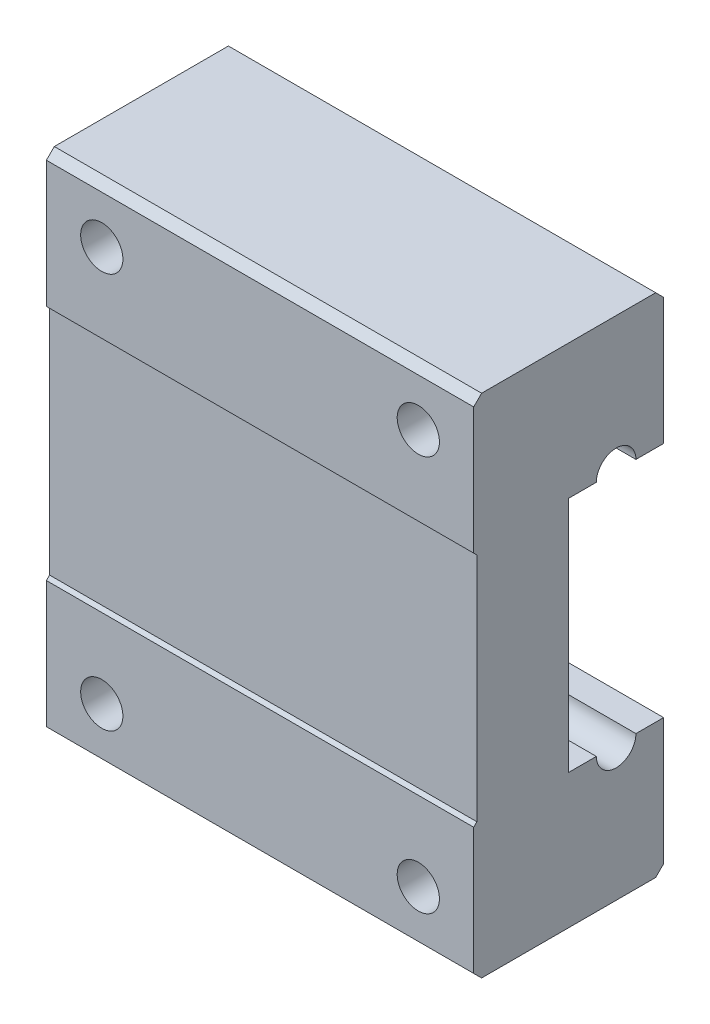
ISO-10303-21;
HEADER;
FILE_DESCRIPTION(('STEP AP214'),'2;1');
FILE_NAME('part.step','',(''),(''),'','','');
FILE_SCHEMA(('AUTOMOTIVE_DESIGN { 1 0 10303 214 1 1 1 1 }'));
ENDSEC;
DATA;
#1=APPLICATION_CONTEXT('core data for automotive mechanical design processes');
#2=APPLICATION_PROTOCOL_DEFINITION('international standard','automotive_design',2000,#1);
#3=PRODUCT_CONTEXT('',#1,'mechanical');
#4=PRODUCT('Part','Part','',(#3));
#5=PRODUCT_RELATED_PRODUCT_CATEGORY('part','',(#4));
#6=PRODUCT_DEFINITION_FORMATION('','',#4);
#7=PRODUCT_DEFINITION_CONTEXT('part definition',#1,'design');
#8=PRODUCT_DEFINITION('design','',#6,#7);
#9=PRODUCT_DEFINITION_SHAPE('','',#8);
#10=(LENGTH_UNIT() NAMED_UNIT(*) SI_UNIT(.MILLI.,.METRE.));
#11=(NAMED_UNIT(*) PLANE_ANGLE_UNIT() SI_UNIT($,.RADIAN.));
#12=(NAMED_UNIT(*) SI_UNIT($,.STERADIAN.) SOLID_ANGLE_UNIT());
#13=UNCERTAINTY_MEASURE_WITH_UNIT(LENGTH_MEASURE(1.E-05),#10,'distance_accuracy_value','');
#14=(GEOMETRIC_REPRESENTATION_CONTEXT(3) GLOBAL_UNCERTAINTY_ASSIGNED_CONTEXT((#13)) GLOBAL_UNIT_ASSIGNED_CONTEXT((#10,
#11,#12)) REPRESENTATION_CONTEXT('',''));
#15=CARTESIAN_POINT('',(0.,0.,0.));
#16=DIRECTION('',(0.,0.,1.));
#17=DIRECTION('',(1.,0.,0.));
#18=AXIS2_PLACEMENT_3D('',#15,#16,#17);
#19=CARTESIAN_POINT('',(10.,-12.5,1.));
#20=DIRECTION('',(0.,0.,1.));
#21=DIRECTION('',(0.,-1.,0.));
#22=AXIS2_PLACEMENT_3D('',#19,#20,#21);
#23=PLANE('',#22);
#24=CARTESIAN_POINT('',(10.,-12.5,1.));
#25=DIRECTION('',(0.,0.,-1.));
#26=DIRECTION('',(-1.,0.,0.));
#27=AXIS2_PLACEMENT_3D('',#24,#25,#26);
#28=CIRCLE('',#27,1.33555);
#29=CARTESIAN_POINT('',(8.66445,-12.5,1.));
#30=VERTEX_POINT('',#29);
#31=EDGE_CURVE('E20',#30,#30,#28,.F.);
#32=ORIENTED_EDGE('',*,*,#31,.T.);
#33=EDGE_LOOP('',(#32));
#34=FACE_BOUND('',#33,.T.);
#35=ADVANCED_FACE('F17',(#34),#23,.T.);
#36=CARTESIAN_POINT('',(-10.,-12.5,1.));
#37=DIRECTION('',(0.,0.,1.));
#38=DIRECTION('',(0.,-1.,0.));
#39=AXIS2_PLACEMENT_3D('',#36,#37,#38);
#40=PLANE('',#39);
#41=CARTESIAN_POINT('',(-10.,-12.5,1.));
#42=DIRECTION('',(0.,0.,-1.));
#43=DIRECTION('',(-1.,0.,0.));
#44=AXIS2_PLACEMENT_3D('',#41,#42,#43);
#45=CIRCLE('',#44,1.33555);
#46=CARTESIAN_POINT('',(-11.33555,-12.5,1.));
#47=VERTEX_POINT('',#46);
#48=EDGE_CURVE('E271',#47,#47,#45,.F.);
#49=ORIENTED_EDGE('',*,*,#48,.T.);
#50=EDGE_LOOP('',(#49));
#51=FACE_BOUND('',#50,.T.);
#52=ADVANCED_FACE('F704',(#51),#40,.T.);
#53=CARTESIAN_POINT('',(10.,12.5,0.999999999999999));
#54=DIRECTION('',(0.,0.,1.));
#55=DIRECTION('',(0.,-1.,0.));
#56=AXIS2_PLACEMENT_3D('',#53,#54,#55);
#57=PLANE('',#56);
#58=CARTESIAN_POINT('',(10.,12.5,0.999999999999999));
#59=DIRECTION('',(0.,0.,-1.));
#60=DIRECTION('',(-1.,0.,0.));
#61=AXIS2_PLACEMENT_3D('',#58,#59,#60);
#62=CIRCLE('',#61,1.33555);
#63=CARTESIAN_POINT('',(8.66445,12.5,0.999999999999999));
#64=VERTEX_POINT('',#63);
#65=EDGE_CURVE('E247',#64,#64,#62,.F.);
#66=ORIENTED_EDGE('',*,*,#65,.T.);
#67=EDGE_LOOP('',(#66));
#68=FACE_BOUND('',#67,.T.);
#69=ADVANCED_FACE('F325',(#68),#57,.T.);
#70=CARTESIAN_POINT('',(-10.,12.5,0.999999999999999));
#71=DIRECTION('',(0.,0.,1.));
#72=DIRECTION('',(0.,-1.,0.));
#73=AXIS2_PLACEMENT_3D('',#70,#71,#72);
#74=PLANE('',#73);
#75=CARTESIAN_POINT('',(-10.,12.5,0.999999999999999));
#76=DIRECTION('',(0.,0.,-1.));
#77=DIRECTION('',(-1.,0.,0.));
#78=AXIS2_PLACEMENT_3D('',#75,#76,#77);
#79=CIRCLE('',#78,1.33555);
#80=CARTESIAN_POINT('',(-11.33555,12.5,0.999999999999999));
#81=VERTEX_POINT('',#80);
#82=EDGE_CURVE('E243',#81,#81,#79,.F.);
#83=ORIENTED_EDGE('',*,*,#82,.T.);
#84=EDGE_LOOP('',(#83));
#85=FACE_BOUND('',#84,.T.);
#86=ADVANCED_FACE('F314',(#85),#74,.T.);
#87=CARTESIAN_POINT('',(10.,-12.5,6.));
#88=DIRECTION('',(0.,0.,-1.));
#89=DIRECTION('',(-1.,0.,0.));
#90=AXIS2_PLACEMENT_3D('',#87,#88,#89);
#91=CYLINDRICAL_SURFACE('',#90,1.33555);
#92=CARTESIAN_POINT('',(10.,-12.5,6.));
#93=DIRECTION('',(0.,0.,-1.));
#94=DIRECTION('',(-1.,0.,0.));
#95=AXIS2_PLACEMENT_3D('',#92,#93,#94);
#96=CIRCLE('',#95,1.33555);
#97=CARTESIAN_POINT('',(8.66445,-12.5,6.));
#98=VERTEX_POINT('',#97);
#99=EDGE_CURVE('E210',#98,#98,#96,.T.);
#100=ORIENTED_EDGE('',*,*,#99,.F.);
#101=EDGE_LOOP('',(#100));
#102=FACE_BOUND('',#101,.T.);
#103=ORIENTED_EDGE('',*,*,#31,.F.);
#104=EDGE_LOOP('',(#103));
#105=FACE_BOUND('',#104,.T.);
#106=ADVANCED_FACE('F311',(#102,#105),#91,.F.);
#107=CARTESIAN_POINT('',(-10.,-12.5,6.));
#108=DIRECTION('',(0.,0.,-1.));
#109=DIRECTION('',(-1.,0.,0.));
#110=AXIS2_PLACEMENT_3D('',#107,#108,#109);
#111=CYLINDRICAL_SURFACE('',#110,1.33555);
#112=CARTESIAN_POINT('',(-10.,-12.5,6.));
#113=DIRECTION('',(0.,0.,-1.));
#114=DIRECTION('',(-1.,0.,0.));
#115=AXIS2_PLACEMENT_3D('',#112,#113,#114);
#116=CIRCLE('',#115,1.33555);
#117=CARTESIAN_POINT('',(-11.33555,-12.5,6.));
#118=VERTEX_POINT('',#117);
#119=EDGE_CURVE('E274',#118,#118,#116,.T.);
#120=ORIENTED_EDGE('',*,*,#119,.F.);
#121=EDGE_LOOP('',(#120));
#122=FACE_BOUND('',#121,.T.);
#123=ORIENTED_EDGE('',*,*,#48,.F.);
#124=EDGE_LOOP('',(#123));
#125=FACE_BOUND('',#124,.T.);
#126=ADVANCED_FACE('F313',(#122,#125),#111,.F.);
#127=CARTESIAN_POINT('',(0.,-15.75,5.75));
#128=DIRECTION('',(0.,-0.707106781186548,0.707106781186548));
#129=DIRECTION('',(0.,-0.707106781186548,-0.707106781186548));
#130=AXIS2_PLACEMENT_3D('',#127,#128,#129);
#131=PLANE('',#130);
#132=DIRECTION('',(0.,-0.707106781186548,-0.707106781186548));
#133=VECTOR('',#132,1.);
#134=CARTESIAN_POINT('',(-13.5,-15.75,5.75));
#135=LINE('',#134,#133);
#136=CARTESIAN_POINT('',(-13.5,-15.5,6.));
#137=VERTEX_POINT('',#136);
#138=CARTESIAN_POINT('',(-13.5,-16.,5.5));
#139=VERTEX_POINT('',#138);
#140=EDGE_CURVE('E260',#137,#139,#135,.T.);
#141=ORIENTED_EDGE('',*,*,#140,.T.);
#142=DIRECTION('',(1.,0.,0.));
#143=VECTOR('',#142,1.);
#144=CARTESIAN_POINT('',(0.,-16.,5.5));
#145=LINE('',#144,#143);
#146=CARTESIAN_POINT('',(13.5,-16.,5.5));
#147=VERTEX_POINT('',#146);
#148=EDGE_CURVE('E201',#147,#139,#145,.F.);
#149=ORIENTED_EDGE('',*,*,#148,.F.);
#150=DIRECTION('',(0.,-0.707106781186548,-0.707106781186548));
#151=VECTOR('',#150,1.);
#152=CARTESIAN_POINT('',(13.5,-15.75,5.75));
#153=LINE('',#152,#151);
#154=CARTESIAN_POINT('',(13.5,-15.5,6.));
#155=VERTEX_POINT('',#154);
#156=EDGE_CURVE('E268',#147,#155,#153,.F.);
#157=ORIENTED_EDGE('',*,*,#156,.T.);
#158=DIRECTION('',(1.,0.,0.));
#159=VECTOR('',#158,1.);
#160=CARTESIAN_POINT('',(0.,-15.5,6.));
#161=LINE('',#160,#159);
#162=EDGE_CURVE('E207',#137,#155,#161,.T.);
#163=ORIENTED_EDGE('',*,*,#162,.F.);
#164=EDGE_LOOP('',(#141,#149,#157,#163));
#165=FACE_BOUND('',#164,.T.);
#166=ADVANCED_FACE('F322',(#165),#131,.T.);
#167=CARTESIAN_POINT('',(0.,-15.75,-5.75));
#168=DIRECTION('',(0.,-0.707106781186546,-0.707106781186549));
#169=DIRECTION('',(0.,0.707106781186549,-0.707106781186546));
#170=AXIS2_PLACEMENT_3D('',#167,#168,#169);
#171=PLANE('',#170);
#172=DIRECTION('',(0.,0.707106781186549,-0.707106781186546));
#173=VECTOR('',#172,1.);
#174=CARTESIAN_POINT('',(-13.5,-15.75,-5.75));
#175=LINE('',#174,#173);
#176=CARTESIAN_POINT('',(-13.5,-16.,-5.5));
#177=VERTEX_POINT('',#176);
#178=CARTESIAN_POINT('',(-13.5,-15.5,-6.));
#179=VERTEX_POINT('',#178);
#180=EDGE_CURVE('E257',#177,#179,#175,.T.);
#181=ORIENTED_EDGE('',*,*,#180,.T.);
#182=DIRECTION('',(1.,0.,0.));
#183=VECTOR('',#182,1.);
#184=CARTESIAN_POINT('',(0.,-15.5,-6.));
#185=LINE('',#184,#183);
#186=CARTESIAN_POINT('',(13.5,-15.5,-6.));
#187=VERTEX_POINT('',#186);
#188=EDGE_CURVE('E191',#187,#179,#185,.F.);
#189=ORIENTED_EDGE('',*,*,#188,.F.);
#190=DIRECTION('',(0.,0.707106781186549,-0.707106781186546));
#191=VECTOR('',#190,1.);
#192=CARTESIAN_POINT('',(13.5,-15.75,-5.75));
#193=LINE('',#192,#191);
#194=CARTESIAN_POINT('',(13.5,-16.,-5.5));
#195=VERTEX_POINT('',#194);
#196=EDGE_CURVE('E258',#187,#195,#193,.F.);
#197=ORIENTED_EDGE('',*,*,#196,.T.);
#198=DIRECTION('',(1.,0.,0.));
#199=VECTOR('',#198,1.);
#200=CARTESIAN_POINT('',(0.,-16.,-5.5));
#201=LINE('',#200,#199);
#202=EDGE_CURVE('E206',#177,#195,#201,.T.);
#203=ORIENTED_EDGE('',*,*,#202,.F.);
#204=EDGE_LOOP('',(#181,#189,#197,#203));
#205=FACE_BOUND('',#204,.T.);
#206=ADVANCED_FACE('F412',(#205),#171,.T.);
#207=CARTESIAN_POINT('',(0.,15.75,-5.75));
#208=DIRECTION('',(0.,0.707106781186548,-0.707106781186548));
#209=DIRECTION('',(0.,0.707106781186548,0.707106781186548));
#210=AXIS2_PLACEMENT_3D('',#207,#208,#209);
#211=PLANE('',#210);
#212=DIRECTION('',(0.,0.707106781186548,0.707106781186548));
#213=VECTOR('',#212,1.);
#214=CARTESIAN_POINT('',(-13.5,15.75,-5.75));
#215=LINE('',#214,#213);
#216=CARTESIAN_POINT('',(-13.5,15.5,-6.));
#217=VERTEX_POINT('',#216);
#218=CARTESIAN_POINT('',(-13.5,16.,-5.5));
#219=VERTEX_POINT('',#218);
#220=EDGE_CURVE('E251',#217,#219,#215,.T.);
#221=ORIENTED_EDGE('',*,*,#220,.T.);
#222=DIRECTION('',(1.,0.,0.));
#223=VECTOR('',#222,1.);
#224=CARTESIAN_POINT('',(0.,16.,-5.5));
#225=LINE('',#224,#223);
#226=CARTESIAN_POINT('',(13.5,16.,-5.5));
#227=VERTEX_POINT('',#226);
#228=EDGE_CURVE('E150',#227,#219,#225,.F.);
#229=ORIENTED_EDGE('',*,*,#228,.F.);
#230=DIRECTION('',(0.,0.707106781186548,0.707106781186548));
#231=VECTOR('',#230,1.);
#232=CARTESIAN_POINT('',(13.5,15.75,-5.75));
#233=LINE('',#232,#231);
#234=CARTESIAN_POINT('',(13.5,15.5,-6.));
#235=VERTEX_POINT('',#234);
#236=EDGE_CURVE('E254',#227,#235,#233,.F.);
#237=ORIENTED_EDGE('',*,*,#236,.T.);
#238=DIRECTION('',(-1.,0.,0.));
#239=VECTOR('',#238,1.);
#240=CARTESIAN_POINT('',(0.,15.5,-6.));
#241=LINE('',#240,#239);
#242=EDGE_CURVE('E157',#217,#235,#241,.F.);
#243=ORIENTED_EDGE('',*,*,#242,.F.);
#244=EDGE_LOOP('',(#221,#229,#237,#243));
#245=FACE_BOUND('',#244,.T.);
#246=ADVANCED_FACE('F408',(#245),#211,.T.);
#247=CARTESIAN_POINT('',(0.,15.75,5.75));
#248=DIRECTION('',(0.,0.707106781186548,0.707106781186547));
#249=DIRECTION('',(0.,-0.707106781186547,0.707106781186548));
#250=AXIS2_PLACEMENT_3D('',#247,#248,#249);
#251=PLANE('',#250);
#252=DIRECTION('',(0.,-0.707106781186547,0.707106781186548));
#253=VECTOR('',#252,1.);
#254=CARTESIAN_POINT('',(-13.5,15.75,5.75));
#255=LINE('',#254,#253);
#256=CARTESIAN_POINT('',(-13.5,16.,5.5));
#257=VERTEX_POINT('',#256);
#258=CARTESIAN_POINT('',(-13.5,15.5,6.));
#259=VERTEX_POINT('',#258);
#260=EDGE_CURVE('E244',#257,#259,#255,.T.);
#261=ORIENTED_EDGE('',*,*,#260,.T.);
#262=DIRECTION('',(1.,0.,0.));
#263=VECTOR('',#262,1.);
#264=CARTESIAN_POINT('',(0.,15.5,6.));
#265=LINE('',#264,#263);
#266=CARTESIAN_POINT('',(13.5,15.5,6.));
#267=VERTEX_POINT('',#266);
#268=EDGE_CURVE('E143',#267,#259,#265,.F.);
#269=ORIENTED_EDGE('',*,*,#268,.F.);
#270=DIRECTION('',(0.,-0.707106781186547,0.707106781186548));
#271=VECTOR('',#270,1.);
#272=CARTESIAN_POINT('',(13.5,15.75,5.75));
#273=LINE('',#272,#271);
#274=CARTESIAN_POINT('',(13.5,16.,5.5));
#275=VERTEX_POINT('',#274);
#276=EDGE_CURVE('E248',#267,#275,#273,.F.);
#277=ORIENTED_EDGE('',*,*,#276,.T.);
#278=DIRECTION('',(1.,0.,0.));
#279=VECTOR('',#278,1.);
#280=CARTESIAN_POINT('',(0.,16.,5.5));
#281=LINE('',#280,#279);
#282=EDGE_CURVE('E153',#257,#275,#281,.T.);
#283=ORIENTED_EDGE('',*,*,#282,.F.);
#284=EDGE_LOOP('',(#261,#269,#277,#283));
#285=FACE_BOUND('',#284,.T.);
#286=ADVANCED_FACE('F404',(#285),#251,.T.);
#287=CARTESIAN_POINT('',(10.,12.5,6.));
#288=DIRECTION('',(0.,0.,-1.));
#289=DIRECTION('',(-1.,0.,0.));
#290=AXIS2_PLACEMENT_3D('',#287,#288,#289);
#291=CYLINDRICAL_SURFACE('',#290,1.33555);
#292=CARTESIAN_POINT('',(10.,12.5,6.));
#293=DIRECTION('',(0.,0.,-1.));
#294=DIRECTION('',(-1.,0.,0.));
#295=AXIS2_PLACEMENT_3D('',#292,#293,#294);
#296=CIRCLE('',#295,1.33555);
#297=CARTESIAN_POINT('',(8.66445,12.5,6.));
#298=VERTEX_POINT('',#297);
#299=EDGE_CURVE('E146',#298,#298,#296,.T.);
#300=ORIENTED_EDGE('',*,*,#299,.F.);
#301=EDGE_LOOP('',(#300));
#302=FACE_BOUND('',#301,.T.);
#303=ORIENTED_EDGE('',*,*,#65,.F.);
#304=EDGE_LOOP('',(#303));
#305=FACE_BOUND('',#304,.T.);
#306=ADVANCED_FACE('F400',(#302,#305),#291,.F.);
#307=CARTESIAN_POINT('',(-10.,12.5,6.));
#308=DIRECTION('',(0.,0.,-1.));
#309=DIRECTION('',(-1.,0.,0.));
#310=AXIS2_PLACEMENT_3D('',#307,#308,#309);
#311=CYLINDRICAL_SURFACE('',#310,1.33555);
#312=CARTESIAN_POINT('',(-10.,12.5,6.));
#313=DIRECTION('',(0.,0.,-1.));
#314=DIRECTION('',(-1.,0.,0.));
#315=AXIS2_PLACEMENT_3D('',#312,#313,#314);
#316=CIRCLE('',#315,1.33555);
#317=CARTESIAN_POINT('',(-11.33555,12.5,6.));
#318=VERTEX_POINT('',#317);
#319=EDGE_CURVE('E142',#318,#318,#316,.T.);
#320=ORIENTED_EDGE('',*,*,#319,.F.);
#321=EDGE_LOOP('',(#320));
#322=FACE_BOUND('',#321,.T.);
#323=ORIENTED_EDGE('',*,*,#82,.F.);
#324=EDGE_LOOP('',(#323));
#325=FACE_BOUND('',#324,.T.);
#326=ADVANCED_FACE('F396',(#322,#325),#311,.F.);
#327=CARTESIAN_POINT('',(13.5,7.4,5.9));
#328=DIRECTION('',(0.,-0.707106781186548,0.707106781186548));
#329=DIRECTION('',(0.,-0.707106781186548,-0.707106781186548));
#330=AXIS2_PLACEMENT_3D('',#327,#328,#329);
#331=PLANE('',#330);
#332=DIRECTION('',(0.,-0.707106781186548,-0.707106781186548));
#333=VECTOR('',#332,1.);
#334=CARTESIAN_POINT('',(-13.5,7.4,5.9));
#335=LINE('',#334,#333);
#336=CARTESIAN_POINT('',(-13.5,7.5,6.));
#337=VERTEX_POINT('',#336);
#338=CARTESIAN_POINT('',(-13.5,7.3,5.8));
#339=VERTEX_POINT('',#338);
#340=EDGE_CURVE('E237',#337,#339,#335,.T.);
#341=ORIENTED_EDGE('',*,*,#340,.T.);
#342=DIRECTION('',(-1.,0.,0.));
#343=VECTOR('',#342,1.);
#344=CARTESIAN_POINT('',(13.5,7.3,5.8));
#345=LINE('',#344,#343);
#346=CARTESIAN_POINT('',(13.5,7.3,5.8));
#347=VERTEX_POINT('',#346);
#348=EDGE_CURVE('E139',#339,#347,#345,.F.);
#349=ORIENTED_EDGE('',*,*,#348,.T.);
#350=DIRECTION('',(0.,-0.707106781186548,-0.707106781186548));
#351=VECTOR('',#350,1.);
#352=CARTESIAN_POINT('',(13.5,7.4,5.9));
#353=LINE('',#352,#351);
#354=CARTESIAN_POINT('',(13.5,7.5,6.));
#355=VERTEX_POINT('',#354);
#356=EDGE_CURVE('E240',#347,#355,#353,.F.);
#357=ORIENTED_EDGE('',*,*,#356,.T.);
#358=DIRECTION('',(1.,0.,0.));
#359=VECTOR('',#358,1.);
#360=CARTESIAN_POINT('',(0.,7.5,6.));
#361=LINE('',#360,#359);
#362=EDGE_CURVE('E147',#337,#355,#361,.T.);
#363=ORIENTED_EDGE('',*,*,#362,.F.);
#364=EDGE_LOOP('',(#341,#349,#357,#363));
#365=FACE_BOUND('',#364,.T.);
#366=ADVANCED_FACE('F392',(#365),#331,.T.);
#367=CARTESIAN_POINT('',(13.5,-7.4,5.9));
#368=DIRECTION('',(0.,0.707106781186548,0.707106781186548));
#369=DIRECTION('',(0.,-0.707106781186548,0.707106781186548));
#370=AXIS2_PLACEMENT_3D('',#367,#368,#369);
#371=PLANE('',#370);
#372=DIRECTION('',(0.,-0.707106781186548,0.707106781186548));
#373=VECTOR('',#372,1.);
#374=CARTESIAN_POINT('',(-13.5,-7.4,5.9));
#375=LINE('',#374,#373);
#376=CARTESIAN_POINT('',(-13.5,-7.3,5.8));
#377=VERTEX_POINT('',#376);
#378=CARTESIAN_POINT('',(-13.5,-7.5,6.));
#379=VERTEX_POINT('',#378);
#380=EDGE_CURVE('E214',#377,#379,#375,.T.);
#381=ORIENTED_EDGE('',*,*,#380,.T.);
#382=DIRECTION('',(1.,0.,0.));
#383=VECTOR('',#382,1.);
#384=CARTESIAN_POINT('',(0.,-7.5,6.));
#385=LINE('',#384,#383);
#386=CARTESIAN_POINT('',(13.5,-7.5,6.));
#387=VERTEX_POINT('',#386);
#388=EDGE_CURVE('E211',#387,#379,#385,.F.);
#389=ORIENTED_EDGE('',*,*,#388,.F.);
#390=DIRECTION('',(0.,-0.707106781186548,0.707106781186548));
#391=VECTOR('',#390,1.);
#392=CARTESIAN_POINT('',(13.5,-7.4,5.9));
#393=LINE('',#392,#391);
#394=CARTESIAN_POINT('',(13.5,-7.3,5.8));
#395=VERTEX_POINT('',#394);
#396=EDGE_CURVE('E234',#387,#395,#393,.F.);
#397=ORIENTED_EDGE('',*,*,#396,.T.);
#398=DIRECTION('',(-1.,0.,0.));
#399=VECTOR('',#398,1.);
#400=CARTESIAN_POINT('',(13.5,-7.3,5.8));
#401=LINE('',#400,#399);
#402=EDGE_CURVE('E136',#395,#377,#401,.T.);
#403=ORIENTED_EDGE('',*,*,#402,.T.);
#404=EDGE_LOOP('',(#381,#389,#397,#403));
#405=FACE_BOUND('',#404,.T.);
#406=ADVANCED_FACE('F388',(#405),#371,.T.);
#407=CARTESIAN_POINT('',(0.,16.,6.));
#408=DIRECTION('',(0.,0.,1.));
#409=DIRECTION('',(0.,-1.,0.));
#410=AXIS2_PLACEMENT_3D('',#407,#408,#409);
#411=PLANE('',#410);
#412=ORIENTED_EDGE('',*,*,#119,.T.);
#413=EDGE_LOOP('',(#412));
#414=FACE_BOUND('',#413,.T.);
#415=ORIENTED_EDGE('',*,*,#99,.T.);
#416=EDGE_LOOP('',(#415));
#417=FACE_BOUND('',#416,.T.);
#418=ORIENTED_EDGE('',*,*,#162,.T.);
#419=DIRECTION('',(0.,1.,0.));
#420=VECTOR('',#419,1.);
#421=CARTESIAN_POINT('',(13.5,0.,6.));
#422=LINE('',#421,#420);
#423=EDGE_CURVE('E132',#387,#155,#422,.F.);
#424=ORIENTED_EDGE('',*,*,#423,.F.);
#425=ORIENTED_EDGE('',*,*,#388,.T.);
#426=DIRECTION('',(0.,1.,0.));
#427=VECTOR('',#426,1.);
#428=CARTESIAN_POINT('',(-13.5,0.,6.));
#429=LINE('',#428,#427);
#430=EDGE_CURVE('E184',#379,#137,#429,.F.);
#431=ORIENTED_EDGE('',*,*,#430,.T.);
#432=EDGE_LOOP('',(#418,#424,#425,#431));
#433=FACE_BOUND('',#432,.T.);
#434=ADVANCED_FACE('F384',(#414,#417,#433),#411,.T.);
#435=CARTESIAN_POINT('',(0.,-16.,6.));
#436=DIRECTION('',(0.,-1.,0.));
#437=DIRECTION('',(0.,0.,-1.));
#438=AXIS2_PLACEMENT_3D('',#435,#436,#437);
#439=PLANE('',#438);
#440=ORIENTED_EDGE('',*,*,#148,.T.);
#441=DIRECTION('',(0.,0.,-1.));
#442=VECTOR('',#441,1.);
#443=CARTESIAN_POINT('',(-13.5,-16.,0.));
#444=LINE('',#443,#442);
#445=EDGE_CURVE('E196',#139,#177,#444,.T.);
#446=ORIENTED_EDGE('',*,*,#445,.T.);
#447=ORIENTED_EDGE('',*,*,#202,.T.);
#448=DIRECTION('',(0.,0.,-1.));
#449=VECTOR('',#448,1.);
#450=CARTESIAN_POINT('',(13.5,-16.,0.));
#451=LINE('',#450,#449);
#452=EDGE_CURVE('E124',#147,#195,#451,.T.);
#453=ORIENTED_EDGE('',*,*,#452,.F.);
#454=EDGE_LOOP('',(#440,#446,#447,#453));
#455=FACE_BOUND('',#454,.T.);
#456=ADVANCED_FACE('F380',(#455),#439,.T.);
#457=CARTESIAN_POINT('',(0.,-16.,-6.));
#458=DIRECTION('',(0.,0.,-1.));
#459=DIRECTION('',(0.,1.,0.));
#460=AXIS2_PLACEMENT_3D('',#457,#458,#459);
#461=PLANE('',#460);
#462=DIRECTION('',(1.,0.,0.));
#463=VECTOR('',#462,1.);
#464=CARTESIAN_POINT('',(0.,-7.5,-6.));
#465=LINE('',#464,#463);
#466=CARTESIAN_POINT('',(13.5,-7.5,-6.));
#467=VERTEX_POINT('',#466);
#468=CARTESIAN_POINT('',(-13.5,-7.5,-6.));
#469=VERTEX_POINT('',#468);
#470=EDGE_CURVE('E108',#467,#469,#465,.F.);
#471=ORIENTED_EDGE('',*,*,#470,.F.);
#472=DIRECTION('',(0.,1.,0.));
#473=VECTOR('',#472,1.);
#474=CARTESIAN_POINT('',(13.5,0.,-6.));
#475=LINE('',#474,#473);
#476=EDGE_CURVE('E122',#187,#467,#475,.T.);
#477=ORIENTED_EDGE('',*,*,#476,.F.);
#478=ORIENTED_EDGE('',*,*,#188,.T.);
#479=DIRECTION('',(0.,1.,0.));
#480=VECTOR('',#479,1.);
#481=CARTESIAN_POINT('',(-13.5,0.,-6.));
#482=LINE('',#481,#480);
#483=EDGE_CURVE('E194',#179,#469,#482,.T.);
#484=ORIENTED_EDGE('',*,*,#483,.T.);
#485=EDGE_LOOP('',(#471,#477,#478,#484));
#486=FACE_BOUND('',#485,.T.);
#487=ADVANCED_FACE('F377',(#486),#461,.T.);
#488=CARTESIAN_POINT('',(0.,-7.5,-6.));
#489=DIRECTION('',(0.,1.,0.));
#490=DIRECTION('',(0.,0.,1.));
#491=AXIS2_PLACEMENT_3D('',#488,#489,#490);
#492=PLANE('',#491);
#493=ORIENTED_EDGE('',*,*,#470,.T.);
#494=DIRECTION('',(0.,0.,-1.));
#495=VECTOR('',#494,1.);
#496=CARTESIAN_POINT('',(-13.5,-7.5,0.));
#497=LINE('',#496,#495);
#498=CARTESIAN_POINT('',(-13.5,-7.5,-4.25));
#499=VERTEX_POINT('',#498);
#500=EDGE_CURVE('E104',#469,#499,#497,.F.);
#501=ORIENTED_EDGE('',*,*,#500,.T.);
#502=DIRECTION('',(1.,0.,0.));
#503=VECTOR('',#502,1.);
#504=CARTESIAN_POINT('',(0.,-7.5,-4.25));
#505=LINE('',#504,#503);
#506=CARTESIAN_POINT('',(13.5,-7.5,-4.25));
#507=VERTEX_POINT('',#506);
#508=EDGE_CURVE('E96',#499,#507,#505,.T.);
#509=ORIENTED_EDGE('',*,*,#508,.T.);
#510=DIRECTION('',(0.,0.,-1.));
#511=VECTOR('',#510,1.);
#512=CARTESIAN_POINT('',(13.5,-7.5,0.));
#513=LINE('',#512,#511);
#514=EDGE_CURVE('E101',#467,#507,#513,.F.);
#515=ORIENTED_EDGE('',*,*,#514,.F.);
#516=EDGE_LOOP('',(#493,#501,#509,#515));
#517=FACE_BOUND('',#516,.T.);
#518=ADVANCED_FACE('F99',(#517),#492,.T.);
#519=CARTESIAN_POINT('',(0.,-7.5,-3.));
#520=DIRECTION('',(1.,0.,0.));
#521=DIRECTION('',(0.,0.,-1.));
#522=AXIS2_PLACEMENT_3D('',#519,#520,#521);
#523=CYLINDRICAL_SURFACE('',#522,1.25);
#524=CARTESIAN_POINT('',(13.5,-7.5,-3.));
#525=DIRECTION('',(1.,0.,0.));
#526=DIRECTION('',(0.,0.,-1.));
#527=AXIS2_PLACEMENT_3D('',#524,#525,#526);
#528=CIRCLE('',#527,1.25);
#529=CARTESIAN_POINT('',(13.5,-7.5,-1.75));
#530=VERTEX_POINT('',#529);
#531=EDGE_CURVE('E112',#507,#530,#528,.F.);
#532=ORIENTED_EDGE('',*,*,#531,.F.);
#533=ORIENTED_EDGE('',*,*,#508,.F.);
#534=CARTESIAN_POINT('',(-13.5,-7.5,-3.));
#535=DIRECTION('',(1.,0.,0.));
#536=DIRECTION('',(0.,0.,-1.));
#537=AXIS2_PLACEMENT_3D('',#534,#535,#536);
#538=CIRCLE('',#537,1.25);
#539=CARTESIAN_POINT('',(-13.5,-7.5,-1.75));
#540=VERTEX_POINT('',#539);
#541=EDGE_CURVE('E288',#499,#540,#538,.F.);
#542=ORIENTED_EDGE('',*,*,#541,.T.);
#543=DIRECTION('',(1.,0.,0.));
#544=VECTOR('',#543,1.);
#545=CARTESIAN_POINT('',(0.,-7.5,-1.75));
#546=LINE('',#545,#544);
#547=EDGE_CURVE('E114',#530,#540,#546,.F.);
#548=ORIENTED_EDGE('',*,*,#547,.F.);
#549=EDGE_LOOP('',(#532,#533,#542,#548));
#550=FACE_BOUND('',#549,.T.);
#551=ADVANCED_FACE('F113',(#550),#523,.F.);
#552=CARTESIAN_POINT('',(0.,7.5,-3.));
#553=DIRECTION('',(1.,0.,0.));
#554=DIRECTION('',(0.,0.,-1.));
#555=AXIS2_PLACEMENT_3D('',#552,#553,#554);
#556=CYLINDRICAL_SURFACE('',#555,1.25);
#557=CARTESIAN_POINT('',(13.5,7.5,-3.));
#558=DIRECTION('',(1.,0.,0.));
#559=DIRECTION('',(0.,0.,-1.));
#560=AXIS2_PLACEMENT_3D('',#557,#558,#559);
#561=CIRCLE('',#560,1.25);
#562=CARTESIAN_POINT('',(13.5,7.5,-1.75));
#563=VERTEX_POINT('',#562);
#564=CARTESIAN_POINT('',(13.5,7.5,-4.25));
#565=VERTEX_POINT('',#564);
#566=EDGE_CURVE('E290',#563,#565,#561,.F.);
#567=ORIENTED_EDGE('',*,*,#566,.F.);
#568=DIRECTION('',(1.,0.,0.));
#569=VECTOR('',#568,1.);
#570=CARTESIAN_POINT('',(0.,7.5,-1.75));
#571=LINE('',#570,#569);
#572=CARTESIAN_POINT('',(-13.5,7.5,-1.75));
#573=VERTEX_POINT('',#572);
#574=EDGE_CURVE('E135',#573,#563,#571,.T.);
#575=ORIENTED_EDGE('',*,*,#574,.F.);
#576=CARTESIAN_POINT('',(-13.5,7.5,-3.));
#577=DIRECTION('',(1.,0.,0.));
#578=DIRECTION('',(0.,0.,-1.));
#579=AXIS2_PLACEMENT_3D('',#576,#577,#578);
#580=CIRCLE('',#579,1.25);
#581=CARTESIAN_POINT('',(-13.5,7.5,-4.25));
#582=VERTEX_POINT('',#581);
#583=EDGE_CURVE('E285',#573,#582,#580,.F.);
#584=ORIENTED_EDGE('',*,*,#583,.T.);
#585=DIRECTION('',(1.,0.,0.));
#586=VECTOR('',#585,1.);
#587=CARTESIAN_POINT('',(0.,7.5,-4.25));
#588=LINE('',#587,#586);
#589=EDGE_CURVE('E107',#565,#582,#588,.F.);
#590=ORIENTED_EDGE('',*,*,#589,.F.);
#591=EDGE_LOOP('',(#567,#575,#584,#590));
#592=FACE_BOUND('',#591,.T.);
#593=ADVANCED_FACE('F368',(#592),#556,.F.);
#594=CARTESIAN_POINT('',(0.,7.5,-4.25));
#595=DIRECTION('',(0.,-1.,0.));
#596=DIRECTION('',(0.,0.,-1.));
#597=AXIS2_PLACEMENT_3D('',#594,#595,#596);
#598=PLANE('',#597);
#599=ORIENTED_EDGE('',*,*,#589,.T.);
#600=DIRECTION('',(0.,0.,-1.));
#601=VECTOR('',#600,1.);
#602=CARTESIAN_POINT('',(-13.5,7.5,0.));
#603=LINE('',#602,#601);
#604=CARTESIAN_POINT('',(-13.5,7.5,-6.));
#605=VERTEX_POINT('',#604);
#606=EDGE_CURVE('E170',#582,#605,#603,.T.);
#607=ORIENTED_EDGE('',*,*,#606,.T.);
#608=DIRECTION('',(-1.,0.,0.));
#609=VECTOR('',#608,1.);
#610=CARTESIAN_POINT('',(0.,7.5,-6.));
#611=LINE('',#610,#609);
#612=CARTESIAN_POINT('',(13.5,7.5,-6.));
#613=VERTEX_POINT('',#612);
#614=EDGE_CURVE('E156',#613,#605,#611,.T.);
#615=ORIENTED_EDGE('',*,*,#614,.F.);
#616=DIRECTION('',(0.,0.,-1.));
#617=VECTOR('',#616,1.);
#618=CARTESIAN_POINT('',(13.5,7.5,0.));
#619=LINE('',#618,#617);
#620=EDGE_CURVE('E227',#565,#613,#619,.T.);
#621=ORIENTED_EDGE('',*,*,#620,.F.);
#622=EDGE_LOOP('',(#599,#607,#615,#621));
#623=FACE_BOUND('',#622,.T.);
#624=ADVANCED_FACE('F364',(#623),#598,.T.);
#625=CARTESIAN_POINT('',(0.,7.5,-6.));
#626=DIRECTION('',(0.,0.,-1.));
#627=DIRECTION('',(-1.,0.,0.));
#628=AXIS2_PLACEMENT_3D('',#625,#626,#627);
#629=PLANE('',#628);
#630=ORIENTED_EDGE('',*,*,#614,.T.);
#631=DIRECTION('',(0.,1.,0.));
#632=VECTOR('',#631,1.);
#633=CARTESIAN_POINT('',(-13.5,0.,-6.));
#634=LINE('',#633,#632);
#635=EDGE_CURVE('E166',#605,#217,#634,.T.);
#636=ORIENTED_EDGE('',*,*,#635,.T.);
#637=ORIENTED_EDGE('',*,*,#242,.T.);
#638=DIRECTION('',(0.,1.,0.));
#639=VECTOR('',#638,1.);
#640=CARTESIAN_POINT('',(13.5,0.,-6.));
#641=LINE('',#640,#639);
#642=EDGE_CURVE('E223',#613,#235,#641,.T.);
#643=ORIENTED_EDGE('',*,*,#642,.F.);
#644=EDGE_LOOP('',(#630,#636,#637,#643));
#645=FACE_BOUND('',#644,.T.);
#646=ADVANCED_FACE('F360',(#645),#629,.T.);
#647=CARTESIAN_POINT('',(0.,16.,-6.));
#648=DIRECTION('',(0.,1.,0.));
#649=DIRECTION('',(0.,0.,1.));
#650=AXIS2_PLACEMENT_3D('',#647,#648,#649);
#651=PLANE('',#650);
#652=ORIENTED_EDGE('',*,*,#228,.T.);
#653=DIRECTION('',(0.,0.,-1.));
#654=VECTOR('',#653,1.);
#655=CARTESIAN_POINT('',(-13.5,16.,0.));
#656=LINE('',#655,#654);
#657=EDGE_CURVE('E169',#219,#257,#656,.F.);
#658=ORIENTED_EDGE('',*,*,#657,.T.);
#659=ORIENTED_EDGE('',*,*,#282,.T.);
#660=DIRECTION('',(0.,0.,-1.));
#661=VECTOR('',#660,1.);
#662=CARTESIAN_POINT('',(13.5,16.,0.));
#663=LINE('',#662,#661);
#664=EDGE_CURVE('E226',#227,#275,#663,.F.);
#665=ORIENTED_EDGE('',*,*,#664,.F.);
#666=EDGE_LOOP('',(#652,#658,#659,#665));
#667=FACE_BOUND('',#666,.T.);
#668=ADVANCED_FACE('F356',(#667),#651,.T.);
#669=CARTESIAN_POINT('',(0.,16.,6.));
#670=DIRECTION('',(0.,0.,1.));
#671=DIRECTION('',(0.,-1.,0.));
#672=AXIS2_PLACEMENT_3D('',#669,#670,#671);
#673=PLANE('',#672);
#674=ORIENTED_EDGE('',*,*,#319,.T.);
#675=EDGE_LOOP('',(#674));
#676=FACE_BOUND('',#675,.T.);
#677=ORIENTED_EDGE('',*,*,#299,.T.);
#678=EDGE_LOOP('',(#677));
#679=FACE_BOUND('',#678,.T.);
#680=ORIENTED_EDGE('',*,*,#268,.T.);
#681=DIRECTION('',(0.,1.,0.));
#682=VECTOR('',#681,1.);
#683=CARTESIAN_POINT('',(-13.5,0.,6.));
#684=LINE('',#683,#682);
#685=EDGE_CURVE('E514',#259,#337,#684,.F.);
#686=ORIENTED_EDGE('',*,*,#685,.T.);
#687=ORIENTED_EDGE('',*,*,#362,.T.);
#688=DIRECTION('',(0.,1.,0.));
#689=VECTOR('',#688,1.);
#690=CARTESIAN_POINT('',(13.5,0.,6.));
#691=LINE('',#690,#689);
#692=EDGE_CURVE('E451',#267,#355,#691,.F.);
#693=ORIENTED_EDGE('',*,*,#692,.F.);
#694=EDGE_LOOP('',(#680,#686,#687,#693));
#695=FACE_BOUND('',#694,.T.);
#696=ADVANCED_FACE('F352',(#676,#679,#695),#673,.T.);
#697=CARTESIAN_POINT('',(13.5,7.5,5.8));
#698=DIRECTION('',(0.,0.,-1.));
#699=DIRECTION('',(-1.,0.,0.));
#700=AXIS2_PLACEMENT_3D('',#697,#698,#699);
#701=PLANE('',#700);
#702=DIRECTION('',(0.,1.,0.));
#703=VECTOR('',#702,1.);
#704=CARTESIAN_POINT('',(13.5,0.,5.8));
#705=LINE('',#704,#703);
#706=EDGE_CURVE('E216',#347,#395,#705,.F.);
#707=ORIENTED_EDGE('',*,*,#706,.F.);
#708=ORIENTED_EDGE('',*,*,#348,.F.);
#709=DIRECTION('',(0.,1.,0.));
#710=VECTOR('',#709,1.);
#711=CARTESIAN_POINT('',(-13.5,0.,5.8));
#712=LINE('',#711,#710);
#713=EDGE_CURVE('E178',#339,#377,#712,.F.);
#714=ORIENTED_EDGE('',*,*,#713,.T.);
#715=ORIENTED_EDGE('',*,*,#402,.F.);
#716=EDGE_LOOP('',(#707,#708,#714,#715));
#717=FACE_BOUND('',#716,.T.);
#718=ADVANCED_FACE('F348',(#717),#701,.F.);
#719=CARTESIAN_POINT('',(0.,7.5,0.));
#720=DIRECTION('',(0.,-1.,0.));
#721=DIRECTION('',(0.,0.,-1.));
#722=AXIS2_PLACEMENT_3D('',#719,#720,#721);
#723=PLANE('',#722);
#724=DIRECTION('',(1.,0.,0.));
#725=VECTOR('',#724,1.);
#726=CARTESIAN_POINT('',(0.,7.5,0.));
#727=LINE('',#726,#725);
#728=CARTESIAN_POINT('',(-13.5,7.5,0.));
#729=VERTEX_POINT('',#728);
#730=CARTESIAN_POINT('',(13.5,7.5,0.));
#731=VERTEX_POINT('',#730);
#732=EDGE_CURVE('E174',#729,#731,#727,.T.);
#733=ORIENTED_EDGE('',*,*,#732,.F.);
#734=DIRECTION('',(0.,0.,-1.));
#735=VECTOR('',#734,1.);
#736=CARTESIAN_POINT('',(-13.5,7.5,0.));
#737=LINE('',#736,#735);
#738=EDGE_CURVE('E287',#729,#573,#737,.T.);
#739=ORIENTED_EDGE('',*,*,#738,.T.);
#740=ORIENTED_EDGE('',*,*,#574,.T.);
#741=DIRECTION('',(0.,0.,-1.));
#742=VECTOR('',#741,1.);
#743=CARTESIAN_POINT('',(13.5,7.5,0.));
#744=LINE('',#743,#742);
#745=EDGE_CURVE('E117',#731,#563,#744,.T.);
#746=ORIENTED_EDGE('',*,*,#745,.F.);
#747=EDGE_LOOP('',(#733,#739,#740,#746));
#748=FACE_BOUND('',#747,.T.);
#749=ADVANCED_FACE('F345',(#748),#723,.T.);
#750=CARTESIAN_POINT('',(13.5,0.,0.));
#751=DIRECTION('',(1.,0.,0.));
#752=DIRECTION('',(0.,0.,-1.));
#753=AXIS2_PLACEMENT_3D('',#750,#751,#752);
#754=PLANE('',#753);
#755=ORIENTED_EDGE('',*,*,#706,.T.);
#756=ORIENTED_EDGE('',*,*,#396,.F.);
#757=ORIENTED_EDGE('',*,*,#423,.T.);
#758=ORIENTED_EDGE('',*,*,#156,.F.);
#759=ORIENTED_EDGE('',*,*,#452,.T.);
#760=ORIENTED_EDGE('',*,*,#196,.F.);
#761=ORIENTED_EDGE('',*,*,#476,.T.);
#762=ORIENTED_EDGE('',*,*,#514,.T.);
#763=ORIENTED_EDGE('',*,*,#531,.T.);
#764=DIRECTION('',(0.,0.,1.));
#765=VECTOR('',#764,1.);
#766=CARTESIAN_POINT('',(13.5,-7.5,-1.75));
#767=LINE('',#766,#765);
#768=CARTESIAN_POINT('',(13.5,-7.5,0.));
#769=VERTEX_POINT('',#768);
#770=EDGE_CURVE('E185',#769,#530,#767,.F.);
#771=ORIENTED_EDGE('',*,*,#770,.F.);
#772=DIRECTION('',(0.,1.,0.));
#773=VECTOR('',#772,1.);
#774=CARTESIAN_POINT('',(13.5,-7.5,0.));
#775=LINE('',#774,#773);
#776=EDGE_CURVE('E177',#731,#769,#775,.F.);
#777=ORIENTED_EDGE('',*,*,#776,.F.);
#778=ORIENTED_EDGE('',*,*,#745,.T.);
#779=ORIENTED_EDGE('',*,*,#566,.T.);
#780=ORIENTED_EDGE('',*,*,#620,.T.);
#781=ORIENTED_EDGE('',*,*,#642,.T.);
#782=ORIENTED_EDGE('',*,*,#236,.F.);
#783=ORIENTED_EDGE('',*,*,#664,.T.);
#784=ORIENTED_EDGE('',*,*,#276,.F.);
#785=ORIENTED_EDGE('',*,*,#692,.T.);
#786=ORIENTED_EDGE('',*,*,#356,.F.);
#787=EDGE_LOOP('',(#755,#756,#757,#758,#759,#760,#761,#762,#763,#771,#777,#778,#779,#780,#781,
#782,#783,#784,#785,#786));
#788=FACE_BOUND('',#787,.T.);
#789=ADVANCED_FACE('F120',(#788),#754,.T.);
#790=CARTESIAN_POINT('',(0.,-7.5,-1.75));
#791=DIRECTION('',(0.,1.,0.));
#792=DIRECTION('',(0.,0.,1.));
#793=AXIS2_PLACEMENT_3D('',#790,#791,#792);
#794=PLANE('',#793);
#795=ORIENTED_EDGE('',*,*,#547,.T.);
#796=DIRECTION('',(0.,0.,-1.));
#797=VECTOR('',#796,1.);
#798=CARTESIAN_POINT('',(-13.5,-7.5,0.));
#799=LINE('',#798,#797);
#800=CARTESIAN_POINT('',(-13.5,-7.5,0.));
#801=VERTEX_POINT('',#800);
#802=EDGE_CURVE('E35',#540,#801,#799,.F.);
#803=ORIENTED_EDGE('',*,*,#802,.T.);
#804=DIRECTION('',(1.,0.,0.));
#805=VECTOR('',#804,1.);
#806=CARTESIAN_POINT('',(0.,-7.5,0.));
#807=LINE('',#806,#805);
#808=EDGE_CURVE('E26',#769,#801,#807,.F.);
#809=ORIENTED_EDGE('',*,*,#808,.F.);
#810=ORIENTED_EDGE('',*,*,#770,.T.);
#811=EDGE_LOOP('',(#795,#803,#809,#810));
#812=FACE_BOUND('',#811,.T.);
#813=ADVANCED_FACE('F337',(#812),#794,.T.);
#814=CARTESIAN_POINT('',(-13.5,0.,0.));
#815=DIRECTION('',(1.,0.,0.));
#816=DIRECTION('',(0.,0.,-1.));
#817=AXIS2_PLACEMENT_3D('',#814,#815,#816);
#818=PLANE('',#817);
#819=ORIENTED_EDGE('',*,*,#713,.F.);
#820=ORIENTED_EDGE('',*,*,#340,.F.);
#821=ORIENTED_EDGE('',*,*,#685,.F.);
#822=ORIENTED_EDGE('',*,*,#260,.F.);
#823=ORIENTED_EDGE('',*,*,#657,.F.);
#824=ORIENTED_EDGE('',*,*,#220,.F.);
#825=ORIENTED_EDGE('',*,*,#635,.F.);
#826=ORIENTED_EDGE('',*,*,#606,.F.);
#827=ORIENTED_EDGE('',*,*,#583,.F.);
#828=ORIENTED_EDGE('',*,*,#738,.F.);
#829=DIRECTION('',(0.,1.,0.));
#830=VECTOR('',#829,1.);
#831=CARTESIAN_POINT('',(-13.5,-7.5,0.));
#832=LINE('',#831,#830);
#833=EDGE_CURVE('E11',#801,#729,#832,.T.);
#834=ORIENTED_EDGE('',*,*,#833,.F.);
#835=ORIENTED_EDGE('',*,*,#802,.F.);
#836=ORIENTED_EDGE('',*,*,#541,.F.);
#837=ORIENTED_EDGE('',*,*,#500,.F.);
#838=ORIENTED_EDGE('',*,*,#483,.F.);
#839=ORIENTED_EDGE('',*,*,#180,.F.);
#840=ORIENTED_EDGE('',*,*,#445,.F.);
#841=ORIENTED_EDGE('',*,*,#140,.F.);
#842=ORIENTED_EDGE('',*,*,#430,.F.);
#843=ORIENTED_EDGE('',*,*,#380,.F.);
#844=EDGE_LOOP('',(#819,#820,#821,#822,#823,#824,#825,#826,#827,#828,#834,#835,#836,#837,#838,
#839,#840,#841,#842,#843));
#845=FACE_BOUND('',#844,.T.);
#846=ADVANCED_FACE('F331',(#845),#818,.F.);
#847=CARTESIAN_POINT('',(0.,-7.5,0.));
#848=DIRECTION('',(0.,0.,-1.));
#849=DIRECTION('',(0.,1.,0.));
#850=AXIS2_PLACEMENT_3D('',#847,#848,#849);
#851=PLANE('',#850);
#852=ORIENTED_EDGE('',*,*,#808,.T.);
#853=ORIENTED_EDGE('',*,*,#833,.T.);
#854=ORIENTED_EDGE('',*,*,#732,.T.);
#855=ORIENTED_EDGE('',*,*,#776,.T.);
#856=EDGE_LOOP('',(#852,#853,#854,#855));
#857=FACE_BOUND('',#856,.T.);
#858=ADVANCED_FACE('F329',(#857),#851,.T.);
#859=CLOSED_SHELL('',(#35,#52,#69,#86,#106,#126,#166,#206,#246,#286,#306,#326,#366,#406,#434,
#456,#487,#518,#551,#593,#624,#646,#668,#696,#718,#749,#789,#813,#846,#858));
#860=MANIFOLD_SOLID_BREP('B1',#859);
#861=ADVANCED_BREP_SHAPE_REPRESENTATION('',(#18,#860),#14);
#862=SHAPE_DEFINITION_REPRESENTATION(#9,#861);
ENDSEC;
END-ISO-10303-21;
